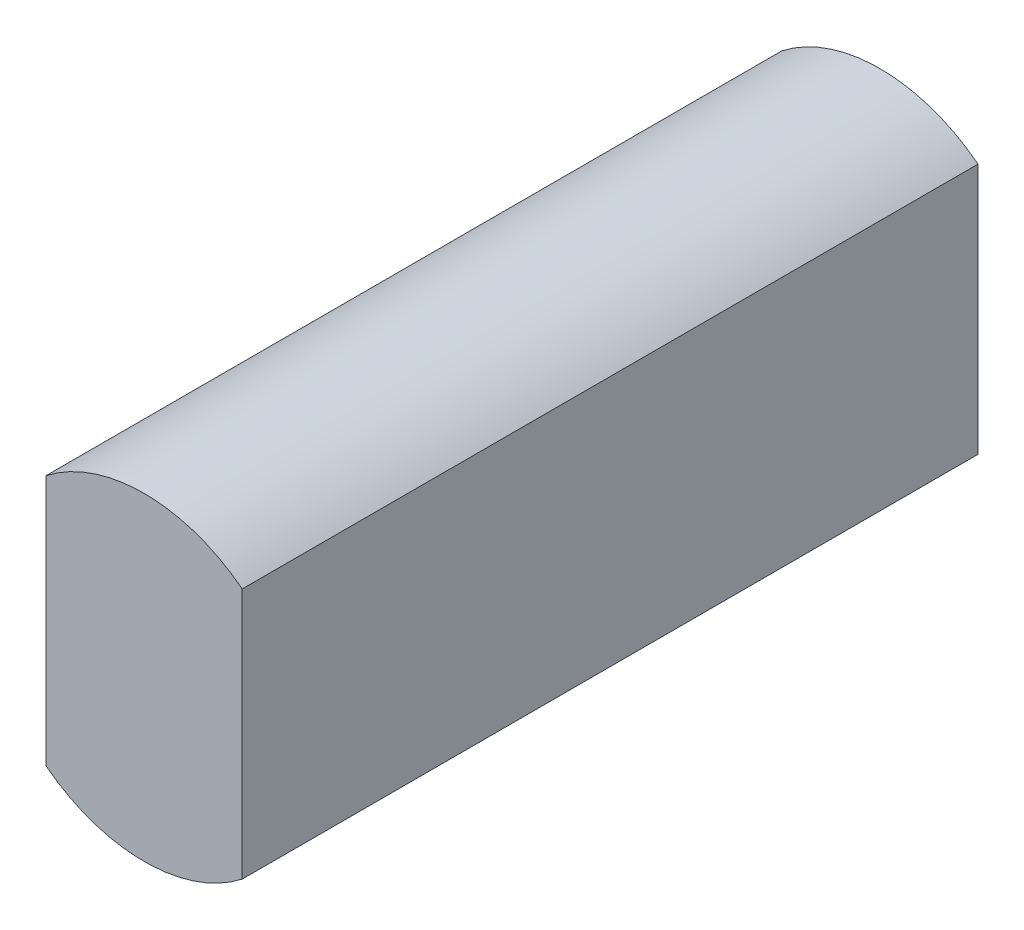
ISO-10303-21;
HEADER;
FILE_DESCRIPTION(('STEP AP214'),'2;1');
FILE_NAME('part.step','',(''),(''),'','','');
FILE_SCHEMA(('AUTOMOTIVE_DESIGN { 1 0 10303 214 1 1 1 1 }'));
ENDSEC;
DATA;
#1=APPLICATION_CONTEXT('core data for automotive mechanical design processes');
#2=APPLICATION_PROTOCOL_DEFINITION('international standard','automotive_design',2000,#1);
#3=PRODUCT_CONTEXT('',#1,'mechanical');
#4=PRODUCT('Part','Part','',(#3));
#5=PRODUCT_RELATED_PRODUCT_CATEGORY('part','',(#4));
#6=PRODUCT_DEFINITION_FORMATION('','',#4);
#7=PRODUCT_DEFINITION_CONTEXT('part definition',#1,'design');
#8=PRODUCT_DEFINITION('design','',#6,#7);
#9=PRODUCT_DEFINITION_SHAPE('','',#8);
#10=(LENGTH_UNIT() NAMED_UNIT(*) SI_UNIT(.MILLI.,.METRE.));
#11=(NAMED_UNIT(*) PLANE_ANGLE_UNIT() SI_UNIT($,.RADIAN.));
#12=(NAMED_UNIT(*) SI_UNIT($,.STERADIAN.) SOLID_ANGLE_UNIT());
#13=UNCERTAINTY_MEASURE_WITH_UNIT(LENGTH_MEASURE(1.E-05),#10,'distance_accuracy_value','');
#14=(GEOMETRIC_REPRESENTATION_CONTEXT(3) GLOBAL_UNCERTAINTY_ASSIGNED_CONTEXT((#13)) GLOBAL_UNIT_ASSIGNED_CONTEXT((#10,
#11,#12)) REPRESENTATION_CONTEXT('',''));
#15=CARTESIAN_POINT('',(0.,0.,0.));
#16=DIRECTION('',(0.,0.,1.));
#17=DIRECTION('',(1.,0.,0.));
#18=AXIS2_PLACEMENT_3D('',#15,#16,#17);
#19=CARTESIAN_POINT('',(0.,0.,20.));
#20=DIRECTION('',(0.,0.,-1.));
#21=DIRECTION('',(-1.,0.,0.));
#22=AXIS2_PLACEMENT_3D('',#19,#20,#21);
#23=CYLINDRICAL_SURFACE('',#22,13.);
#24=DIRECTION('',(0.,0.,-1.));
#25=VECTOR('',#24,1.);
#26=CARTESIAN_POINT('',(8.,10.2469507659596,20.));
#27=LINE('',#26,#25);
#28=CARTESIAN_POINT('',(8.,10.2469507659596,20.));
#29=VERTEX_POINT('',#28);
#30=CARTESIAN_POINT('',(8.,10.2469507659596,-40.));
#31=VERTEX_POINT('',#30);
#32=EDGE_CURVE('E96',#29,#31,#27,.T.);
#33=ORIENTED_EDGE('',*,*,#32,.T.);
#34=CARTESIAN_POINT('',(0.,0.,-40.));
#35=DIRECTION('',(0.,0.,1.));
#36=DIRECTION('',(1.,0.,0.));
#37=AXIS2_PLACEMENT_3D('',#34,#35,#36);
#38=CIRCLE('',#37,13.);
#39=CARTESIAN_POINT('',(-8.,10.2469507659596,-40.));
#40=VERTEX_POINT('',#39);
#41=EDGE_CURVE('E91',#31,#40,#38,.T.);
#42=ORIENTED_EDGE('',*,*,#41,.T.);
#43=DIRECTION('',(0.,0.,-1.));
#44=VECTOR('',#43,1.);
#45=CARTESIAN_POINT('',(-8.,10.2469507659596,20.));
#46=LINE('',#45,#44);
#47=CARTESIAN_POINT('',(-8.,10.2469507659596,20.));
#48=VERTEX_POINT('',#47);
#49=EDGE_CURVE('E11',#48,#40,#46,.T.);
#50=ORIENTED_EDGE('',*,*,#49,.F.);
#51=CARTESIAN_POINT('',(0.,0.,20.));
#52=DIRECTION('',(0.,0.,1.));
#53=DIRECTION('',(1.,0.,0.));
#54=AXIS2_PLACEMENT_3D('',#51,#52,#53);
#55=CIRCLE('',#54,13.);
#56=EDGE_CURVE('E102',#29,#48,#55,.T.);
#57=ORIENTED_EDGE('',*,*,#56,.F.);
#58=EDGE_LOOP('',(#33,#42,#50,#57));
#59=FACE_BOUND('',#58,.T.);
#60=ADVANCED_FACE('F39',(#59),#23,.T.);
#61=CARTESIAN_POINT('',(-8.,10.2469507659596,20.));
#62=DIRECTION('',(1.,0.,0.));
#63=DIRECTION('',(0.,1.,0.));
#64=AXIS2_PLACEMENT_3D('',#61,#62,#63);
#65=PLANE('',#64);
#66=ORIENTED_EDGE('',*,*,#49,.T.);
#67=DIRECTION('',(0.,-1.,0.));
#68=VECTOR('',#67,1.);
#69=CARTESIAN_POINT('',(-8.,10.2469507659596,-40.));
#70=LINE('',#69,#68);
#71=CARTESIAN_POINT('',(-8.,-10.2469507659596,-40.));
#72=VERTEX_POINT('',#71);
#73=EDGE_CURVE('E81',#40,#72,#70,.T.);
#74=ORIENTED_EDGE('',*,*,#73,.T.);
#75=DIRECTION('',(0.,0.,-1.));
#76=VECTOR('',#75,1.);
#77=CARTESIAN_POINT('',(-8.,-10.2469507659596,20.));
#78=LINE('',#77,#76);
#79=CARTESIAN_POINT('',(-8.,-10.2469507659596,20.));
#80=VERTEX_POINT('',#79);
#81=EDGE_CURVE('E46',#80,#72,#78,.T.);
#82=ORIENTED_EDGE('',*,*,#81,.F.);
#83=DIRECTION('',(0.,-1.,0.));
#84=VECTOR('',#83,1.);
#85=CARTESIAN_POINT('',(-8.,10.2469507659596,20.));
#86=LINE('',#85,#84);
#87=EDGE_CURVE('E82',#48,#80,#86,.T.);
#88=ORIENTED_EDGE('',*,*,#87,.F.);
#89=EDGE_LOOP('',(#66,#74,#82,#88));
#90=FACE_BOUND('',#89,.T.);
#91=ADVANCED_FACE('F79',(#90),#65,.F.);
#92=CARTESIAN_POINT('',(0.,0.,20.));
#93=DIRECTION('',(0.,0.,-1.));
#94=DIRECTION('',(-1.,0.,0.));
#95=AXIS2_PLACEMENT_3D('',#92,#93,#94);
#96=CYLINDRICAL_SURFACE('',#95,13.);
#97=ORIENTED_EDGE('',*,*,#81,.T.);
#98=CARTESIAN_POINT('',(0.,0.,-40.));
#99=DIRECTION('',(0.,0.,1.));
#100=DIRECTION('',(1.,0.,0.));
#101=AXIS2_PLACEMENT_3D('',#98,#99,#100);
#102=CIRCLE('',#101,13.);
#103=CARTESIAN_POINT('',(8.,-10.2469507659596,-40.));
#104=VERTEX_POINT('',#103);
#105=EDGE_CURVE('E94',#72,#104,#102,.T.);
#106=ORIENTED_EDGE('',*,*,#105,.T.);
#107=DIRECTION('',(0.,0.,-1.));
#108=VECTOR('',#107,1.);
#109=CARTESIAN_POINT('',(8.,-10.2469507659596,20.));
#110=LINE('',#109,#108);
#111=CARTESIAN_POINT('',(8.,-10.2469507659596,20.));
#112=VERTEX_POINT('',#111);
#113=EDGE_CURVE('E108',#112,#104,#110,.T.);
#114=ORIENTED_EDGE('',*,*,#113,.F.);
#115=CARTESIAN_POINT('',(0.,0.,20.));
#116=DIRECTION('',(0.,0.,1.));
#117=DIRECTION('',(1.,0.,0.));
#118=AXIS2_PLACEMENT_3D('',#115,#116,#117);
#119=CIRCLE('',#118,13.);
#120=EDGE_CURVE('E58',#80,#112,#119,.T.);
#121=ORIENTED_EDGE('',*,*,#120,.F.);
#122=EDGE_LOOP('',(#97,#106,#114,#121));
#123=FACE_BOUND('',#122,.T.);
#124=ADVANCED_FACE('F110',(#123),#96,.T.);
#125=CARTESIAN_POINT('',(8.,10.2469507659596,20.));
#126=DIRECTION('',(-1.,0.,0.));
#127=DIRECTION('',(0.,-1.,0.));
#128=AXIS2_PLACEMENT_3D('',#125,#126,#127);
#129=PLANE('',#128);
#130=ORIENTED_EDGE('',*,*,#113,.T.);
#131=DIRECTION('',(0.,1.,0.));
#132=VECTOR('',#131,1.);
#133=CARTESIAN_POINT('',(8.,10.2469507659596,-40.));
#134=LINE('',#133,#132);
#135=EDGE_CURVE('E100',#104,#31,#134,.T.);
#136=ORIENTED_EDGE('',*,*,#135,.T.);
#137=ORIENTED_EDGE('',*,*,#32,.F.);
#138=DIRECTION('',(0.,1.,0.));
#139=VECTOR('',#138,1.);
#140=CARTESIAN_POINT('',(8.,10.2469507659596,20.));
#141=LINE('',#140,#139);
#142=EDGE_CURVE('E53',#112,#29,#141,.T.);
#143=ORIENTED_EDGE('',*,*,#142,.F.);
#144=EDGE_LOOP('',(#130,#136,#137,#143));
#145=FACE_BOUND('',#144,.T.);
#146=ADVANCED_FACE('F112',(#145),#129,.F.);
#147=CARTESIAN_POINT('',(0.,0.,20.));
#148=DIRECTION('',(0.,0.,1.));
#149=DIRECTION('',(1.,0.,0.));
#150=AXIS2_PLACEMENT_3D('',#147,#148,#149);
#151=PLANE('',#150);
#152=ORIENTED_EDGE('',*,*,#56,.T.);
#153=ORIENTED_EDGE('',*,*,#87,.T.);
#154=ORIENTED_EDGE('',*,*,#120,.T.);
#155=ORIENTED_EDGE('',*,*,#142,.T.);
#156=EDGE_LOOP('',(#152,#153,#154,#155));
#157=FACE_BOUND('',#156,.T.);
#158=ADVANCED_FACE('F113',(#157),#151,.T.);
#159=CARTESIAN_POINT('',(0.,0.,-40.));
#160=DIRECTION('',(0.,0.,1.));
#161=DIRECTION('',(1.,0.,0.));
#162=AXIS2_PLACEMENT_3D('',#159,#160,#161);
#163=PLANE('',#162);
#164=ORIENTED_EDGE('',*,*,#41,.F.);
#165=ORIENTED_EDGE('',*,*,#135,.F.);
#166=ORIENTED_EDGE('',*,*,#105,.F.);
#167=ORIENTED_EDGE('',*,*,#73,.F.);
#168=EDGE_LOOP('',(#164,#165,#166,#167));
#169=FACE_BOUND('',#168,.T.);
#170=ADVANCED_FACE('F89',(#169),#163,.F.);
#171=CLOSED_SHELL('',(#60,#91,#124,#146,#158,#170));
#172=MANIFOLD_SOLID_BREP('B2',#171);
#173=ADVANCED_BREP_SHAPE_REPRESENTATION('',(#18,#172),#14);
#174=SHAPE_DEFINITION_REPRESENTATION(#9,#173);
ENDSEC;
END-ISO-10303-21;
